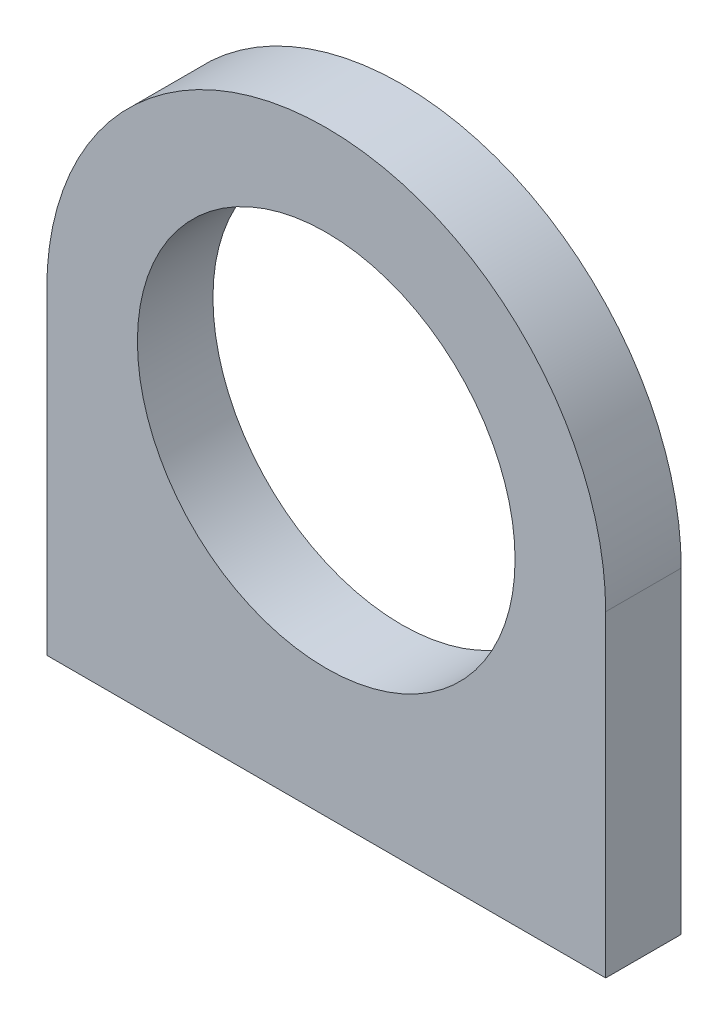
ISO-10303-21;
HEADER;
FILE_DESCRIPTION(('STEP AP214'),'2;1');
FILE_NAME('part.step','',(''),(''),'','','');
FILE_SCHEMA(('AUTOMOTIVE_DESIGN { 1 0 10303 214 1 1 1 1 }'));
ENDSEC;
DATA;
#1=APPLICATION_CONTEXT('core data for automotive mechanical design processes');
#2=APPLICATION_PROTOCOL_DEFINITION('international standard','automotive_design',2000,#1);
#3=PRODUCT_CONTEXT('',#1,'mechanical');
#4=PRODUCT('Part','Part','',(#3));
#5=PRODUCT_RELATED_PRODUCT_CATEGORY('part','',(#4));
#6=PRODUCT_DEFINITION_FORMATION('','',#4);
#7=PRODUCT_DEFINITION_CONTEXT('part definition',#1,'design');
#8=PRODUCT_DEFINITION('design','',#6,#7);
#9=PRODUCT_DEFINITION_SHAPE('','',#8);
#10=(LENGTH_UNIT() NAMED_UNIT(*) SI_UNIT(.MILLI.,.METRE.));
#11=(NAMED_UNIT(*) PLANE_ANGLE_UNIT() SI_UNIT($,.RADIAN.));
#12=(NAMED_UNIT(*) SI_UNIT($,.STERADIAN.) SOLID_ANGLE_UNIT());
#13=UNCERTAINTY_MEASURE_WITH_UNIT(LENGTH_MEASURE(1.E-05),#10,'distance_accuracy_value','');
#14=(GEOMETRIC_REPRESENTATION_CONTEXT(3) GLOBAL_UNCERTAINTY_ASSIGNED_CONTEXT((#13)) GLOBAL_UNIT_ASSIGNED_CONTEXT((#10,
#11,#12)) REPRESENTATION_CONTEXT('',''));
#15=CARTESIAN_POINT('',(0.,0.,0.));
#16=DIRECTION('',(0.,0.,1.));
#17=DIRECTION('',(1.,0.,0.));
#18=AXIS2_PLACEMENT_3D('',#15,#16,#17);
#19=CARTESIAN_POINT('',(18.5,0.,-2.5));
#20=DIRECTION('',(-1.,0.,0.));
#21=DIRECTION('',(0.,0.,1.));
#22=AXIS2_PLACEMENT_3D('',#19,#20,#21);
#23=PLANE('',#22);
#24=DIRECTION('',(0.,0.,1.));
#25=VECTOR('',#24,1.);
#26=CARTESIAN_POINT('',(18.5,0.,-2.5));
#27=LINE('',#26,#25);
#28=CARTESIAN_POINT('',(18.5,0.,-2.5));
#29=VERTEX_POINT('',#28);
#30=CARTESIAN_POINT('',(18.5,0.,2.5));
#31=VERTEX_POINT('',#30);
#32=EDGE_CURVE('E40',#29,#31,#27,.T.);
#33=ORIENTED_EDGE('',*,*,#32,.T.);
#34=DIRECTION('',(0.,-1.,0.));
#35=VECTOR('',#34,1.);
#36=CARTESIAN_POINT('',(18.5,0.,2.5));
#37=LINE('',#36,#35);
#38=CARTESIAN_POINT('',(18.5,-21.,2.5));
#39=VERTEX_POINT('',#38);
#40=EDGE_CURVE('E79',#31,#39,#37,.T.);
#41=ORIENTED_EDGE('',*,*,#40,.T.);
#42=DIRECTION('',(0.,0.,1.));
#43=VECTOR('',#42,1.);
#44=CARTESIAN_POINT('',(18.5,-21.,-2.5));
#45=LINE('',#44,#43);
#46=CARTESIAN_POINT('',(18.5,-21.,-2.5));
#47=VERTEX_POINT('',#46);
#48=EDGE_CURVE('E11',#47,#39,#45,.T.);
#49=ORIENTED_EDGE('',*,*,#48,.F.);
#50=DIRECTION('',(0.,-1.,0.));
#51=VECTOR('',#50,1.);
#52=CARTESIAN_POINT('',(18.5,0.,-2.5));
#53=LINE('',#52,#51);
#54=EDGE_CURVE('E81',#29,#47,#53,.T.);
#55=ORIENTED_EDGE('',*,*,#54,.F.);
#56=EDGE_LOOP('',(#33,#41,#49,#55));
#57=FACE_BOUND('',#56,.T.);
#58=ADVANCED_FACE('F37',(#57),#23,.F.);
#59=CARTESIAN_POINT('',(0.,-21.,-2.5));
#60=DIRECTION('',(0.,1.,0.));
#61=DIRECTION('',(0.,0.,1.));
#62=AXIS2_PLACEMENT_3D('',#59,#60,#61);
#63=PLANE('',#62);
#64=CARTESIAN_POINT('',(16.,-21.,0.));
#65=DIRECTION('',(0.,1.,0.));
#66=DIRECTION('',(0.,0.,-1.));
#67=AXIS2_PLACEMENT_3D('',#64,#65,#66);
#68=CIRCLE('',#67,1.5);
#69=CARTESIAN_POINT('',(16.,-21.,-1.5));
#70=VERTEX_POINT('',#69);
#71=EDGE_CURVE('E173',#70,#70,#68,.T.);
#72=ORIENTED_EDGE('',*,*,#71,.T.);
#73=EDGE_LOOP('',(#72));
#74=FACE_BOUND('',#73,.T.);
#75=CARTESIAN_POINT('',(-16.,-21.,0.));
#76=DIRECTION('',(0.,-1.,0.));
#77=DIRECTION('',(0.,0.,-1.));
#78=AXIS2_PLACEMENT_3D('',#75,#76,#77);
#79=CIRCLE('',#78,1.5);
#80=CARTESIAN_POINT('',(-16.,-21.,-1.5));
#81=VERTEX_POINT('',#80);
#82=EDGE_CURVE('E102',#81,#81,#79,.T.);
#83=ORIENTED_EDGE('',*,*,#82,.F.);
#84=EDGE_LOOP('',(#83));
#85=FACE_BOUND('',#84,.T.);
#86=ORIENTED_EDGE('',*,*,#48,.T.);
#87=DIRECTION('',(-1.,0.,0.));
#88=VECTOR('',#87,1.);
#89=CARTESIAN_POINT('',(0.,-21.,2.5));
#90=LINE('',#89,#88);
#91=CARTESIAN_POINT('',(-18.5,-21.,2.5));
#92=VERTEX_POINT('',#91);
#93=EDGE_CURVE('E98',#39,#92,#90,.T.);
#94=ORIENTED_EDGE('',*,*,#93,.T.);
#95=DIRECTION('',(0.,0.,1.));
#96=VECTOR('',#95,1.);
#97=CARTESIAN_POINT('',(-18.5,-21.,-2.5));
#98=LINE('',#97,#96);
#99=CARTESIAN_POINT('',(-18.5,-21.,-2.5));
#100=VERTEX_POINT('',#99);
#101=EDGE_CURVE('E45',#100,#92,#98,.T.);
#102=ORIENTED_EDGE('',*,*,#101,.F.);
#103=DIRECTION('',(-1.,0.,0.));
#104=VECTOR('',#103,1.);
#105=CARTESIAN_POINT('',(0.,-21.,-2.5));
#106=LINE('',#105,#104);
#107=EDGE_CURVE('E52',#47,#100,#106,.T.);
#108=ORIENTED_EDGE('',*,*,#107,.F.);
#109=EDGE_LOOP('',(#86,#94,#102,#108));
#110=FACE_BOUND('',#109,.T.);
#111=ADVANCED_FACE('F122',(#74,#85,#110),#63,.F.);
#112=CARTESIAN_POINT('',(-18.5,0.,-2.5));
#113=DIRECTION('',(-1.,0.,0.));
#114=DIRECTION('',(0.,0.,1.));
#115=AXIS2_PLACEMENT_3D('',#112,#113,#114);
#116=PLANE('',#115);
#117=ORIENTED_EDGE('',*,*,#101,.T.);
#118=DIRECTION('',(0.,-1.,0.));
#119=VECTOR('',#118,1.);
#120=CARTESIAN_POINT('',(-18.5,0.,2.5));
#121=LINE('',#120,#119);
#122=CARTESIAN_POINT('',(-18.5,0.,2.5));
#123=VERTEX_POINT('',#122);
#124=EDGE_CURVE('E93',#123,#92,#121,.T.);
#125=ORIENTED_EDGE('',*,*,#124,.F.);
#126=DIRECTION('',(0.,0.,1.));
#127=VECTOR('',#126,1.);
#128=CARTESIAN_POINT('',(-18.5,0.,-2.5));
#129=LINE('',#128,#127);
#130=CARTESIAN_POINT('',(-18.5,0.,-2.5));
#131=VERTEX_POINT('',#130);
#132=EDGE_CURVE('E85',#131,#123,#129,.T.);
#133=ORIENTED_EDGE('',*,*,#132,.F.);
#134=DIRECTION('',(0.,-1.,0.));
#135=VECTOR('',#134,1.);
#136=CARTESIAN_POINT('',(-18.5,0.,-2.5));
#137=LINE('',#136,#135);
#138=EDGE_CURVE('E114',#131,#100,#137,.T.);
#139=ORIENTED_EDGE('',*,*,#138,.T.);
#140=EDGE_LOOP('',(#117,#125,#133,#139));
#141=FACE_BOUND('',#140,.T.);
#142=ADVANCED_FACE('F121',(#141),#116,.T.);
#143=CARTESIAN_POINT('',(0.,0.,-2.5));
#144=DIRECTION('',(0.,0.,1.));
#145=DIRECTION('',(1.,0.,0.));
#146=AXIS2_PLACEMENT_3D('',#143,#144,#145);
#147=CYLINDRICAL_SURFACE('',#146,18.5);
#148=ORIENTED_EDGE('',*,*,#132,.T.);
#149=CARTESIAN_POINT('',(0.,0.,2.5));
#150=DIRECTION('',(0.,0.,1.));
#151=DIRECTION('',(1.,0.,0.));
#152=AXIS2_PLACEMENT_3D('',#149,#150,#151);
#153=CIRCLE('',#152,18.5);
#154=EDGE_CURVE('E88',#31,#123,#153,.T.);
#155=ORIENTED_EDGE('',*,*,#154,.F.);
#156=ORIENTED_EDGE('',*,*,#32,.F.);
#157=CARTESIAN_POINT('',(0.,0.,-2.5));
#158=DIRECTION('',(0.,0.,1.));
#159=DIRECTION('',(1.,0.,0.));
#160=AXIS2_PLACEMENT_3D('',#157,#158,#159);
#161=CIRCLE('',#160,18.5);
#162=EDGE_CURVE('E112',#29,#131,#161,.T.);
#163=ORIENTED_EDGE('',*,*,#162,.T.);
#164=EDGE_LOOP('',(#148,#155,#156,#163));
#165=FACE_BOUND('',#164,.T.);
#166=ADVANCED_FACE('F89',(#165),#147,.T.);
#167=CARTESIAN_POINT('',(0.,0.,-2.5));
#168=DIRECTION('',(0.,0.,1.));
#169=DIRECTION('',(1.,0.,0.));
#170=AXIS2_PLACEMENT_3D('',#167,#168,#169);
#171=CYLINDRICAL_SURFACE('',#170,12.5);
#172=CARTESIAN_POINT('',(0.,0.,-2.5));
#173=DIRECTION('',(0.,0.,1.));
#174=DIRECTION('',(1.,0.,0.));
#175=AXIS2_PLACEMENT_3D('',#172,#173,#174);
#176=CIRCLE('',#175,12.5);
#177=CARTESIAN_POINT('',(12.5,0.,-2.5));
#178=VERTEX_POINT('',#177);
#179=EDGE_CURVE('E86',#178,#178,#176,.T.);
#180=ORIENTED_EDGE('',*,*,#179,.F.);
#181=EDGE_LOOP('',(#180));
#182=FACE_BOUND('',#181,.T.);
#183=CARTESIAN_POINT('',(0.,0.,2.5));
#184=DIRECTION('',(0.,0.,1.));
#185=DIRECTION('',(1.,0.,0.));
#186=AXIS2_PLACEMENT_3D('',#183,#184,#185);
#187=CIRCLE('',#186,12.5);
#188=CARTESIAN_POINT('',(12.5,0.,2.5));
#189=VERTEX_POINT('',#188);
#190=EDGE_CURVE('E108',#189,#189,#187,.T.);
#191=ORIENTED_EDGE('',*,*,#190,.T.);
#192=EDGE_LOOP('',(#191));
#193=FACE_BOUND('',#192,.T.);
#194=ADVANCED_FACE('F134',(#182,#193),#171,.F.);
#195=CARTESIAN_POINT('',(0.,0.,-2.5));
#196=DIRECTION('',(0.,0.,1.));
#197=DIRECTION('',(1.,0.,0.));
#198=AXIS2_PLACEMENT_3D('',#195,#196,#197);
#199=PLANE('',#198);
#200=ORIENTED_EDGE('',*,*,#54,.T.);
#201=ORIENTED_EDGE('',*,*,#107,.T.);
#202=ORIENTED_EDGE('',*,*,#138,.F.);
#203=ORIENTED_EDGE('',*,*,#162,.F.);
#204=EDGE_LOOP('',(#200,#201,#202,#203));
#205=FACE_BOUND('',#204,.T.);
#206=ORIENTED_EDGE('',*,*,#179,.T.);
#207=EDGE_LOOP('',(#206));
#208=FACE_BOUND('',#207,.T.);
#209=ADVANCED_FACE('F140',(#205,#208),#199,.F.);
#210=CARTESIAN_POINT('',(0.,0.,2.5));
#211=DIRECTION('',(0.,0.,1.));
#212=DIRECTION('',(1.,0.,0.));
#213=AXIS2_PLACEMENT_3D('',#210,#211,#212);
#214=PLANE('',#213);
#215=ORIENTED_EDGE('',*,*,#40,.F.);
#216=ORIENTED_EDGE('',*,*,#154,.T.);
#217=ORIENTED_EDGE('',*,*,#124,.T.);
#218=ORIENTED_EDGE('',*,*,#93,.F.);
#219=EDGE_LOOP('',(#215,#216,#217,#218));
#220=FACE_BOUND('',#219,.T.);
#221=ORIENTED_EDGE('',*,*,#190,.F.);
#222=EDGE_LOOP('',(#221));
#223=FACE_BOUND('',#222,.T.);
#224=ADVANCED_FACE('F95',(#220,#223),#214,.T.);
#225=CARTESIAN_POINT('',(-16.,-11.,0.));
#226=DIRECTION('',(0.,-1.,0.));
#227=DIRECTION('',(0.,0.,-1.));
#228=AXIS2_PLACEMENT_3D('',#225,#226,#227);
#229=CYLINDRICAL_SURFACE('',#228,1.5);
#230=CARTESIAN_POINT('',(-16.,-11.,0.));
#231=DIRECTION('',(0.,-1.,0.));
#232=DIRECTION('',(0.,0.,-1.));
#233=AXIS2_PLACEMENT_3D('',#230,#231,#232);
#234=CIRCLE('',#233,1.5);
#235=CARTESIAN_POINT('',(-16.,-11.,-1.5));
#236=VERTEX_POINT('',#235);
#237=EDGE_CURVE('E99',#236,#236,#234,.T.);
#238=ORIENTED_EDGE('',*,*,#237,.F.);
#239=EDGE_LOOP('',(#238));
#240=FACE_BOUND('',#239,.T.);
#241=ORIENTED_EDGE('',*,*,#82,.T.);
#242=EDGE_LOOP('',(#241));
#243=FACE_BOUND('',#242,.T.);
#244=ADVANCED_FACE('F149',(#240,#243),#229,.F.);
#245=CARTESIAN_POINT('',(-16.,-11.,0.));
#246=DIRECTION('',(0.,-1.,0.));
#247=DIRECTION('',(0.,0.,-1.));
#248=AXIS2_PLACEMENT_3D('',#245,#246,#247);
#249=PLANE('',#248);
#250=ORIENTED_EDGE('',*,*,#237,.T.);
#251=EDGE_LOOP('',(#250));
#252=FACE_BOUND('',#251,.T.);
#253=ADVANCED_FACE('F154',(#252),#249,.T.);
#254=CARTESIAN_POINT('',(16.,-11.,0.));
#255=DIRECTION('',(0.,-1.,0.));
#256=DIRECTION('',(0.,0.,-1.));
#257=AXIS2_PLACEMENT_3D('',#254,#255,#256);
#258=CYLINDRICAL_SURFACE('',#257,1.5);
#259=CARTESIAN_POINT('',(16.,-11.,0.));
#260=DIRECTION('',(0.,1.,0.));
#261=DIRECTION('',(0.,0.,-1.));
#262=AXIS2_PLACEMENT_3D('',#259,#260,#261);
#263=CIRCLE('',#262,1.5);
#264=CARTESIAN_POINT('',(16.,-11.,-1.5));
#265=VERTEX_POINT('',#264);
#266=EDGE_CURVE('E172',#265,#265,#263,.T.);
#267=ORIENTED_EDGE('',*,*,#266,.T.);
#268=EDGE_LOOP('',(#267));
#269=FACE_BOUND('',#268,.T.);
#270=ORIENTED_EDGE('',*,*,#71,.F.);
#271=EDGE_LOOP('',(#270));
#272=FACE_BOUND('',#271,.T.);
#273=ADVANCED_FACE('F160',(#269,#272),#258,.F.);
#274=CARTESIAN_POINT('',(16.,-11.,0.));
#275=DIRECTION('',(0.,-1.,0.));
#276=DIRECTION('',(0.,0.,-1.));
#277=AXIS2_PLACEMENT_3D('',#274,#275,#276);
#278=PLANE('',#277);
#279=ORIENTED_EDGE('',*,*,#266,.F.);
#280=EDGE_LOOP('',(#279));
#281=FACE_BOUND('',#280,.T.);
#282=ADVANCED_FACE('F164',(#281),#278,.T.);
#283=CLOSED_SHELL('',(#58,#111,#142,#166,#194,#209,#224,#244,#253,#273,#282));
#284=MANIFOLD_SOLID_BREP('B2',#283);
#285=ADVANCED_BREP_SHAPE_REPRESENTATION('',(#18,#284),#14);
#286=SHAPE_DEFINITION_REPRESENTATION(#9,#285);
ENDSEC;
END-ISO-10303-21;
